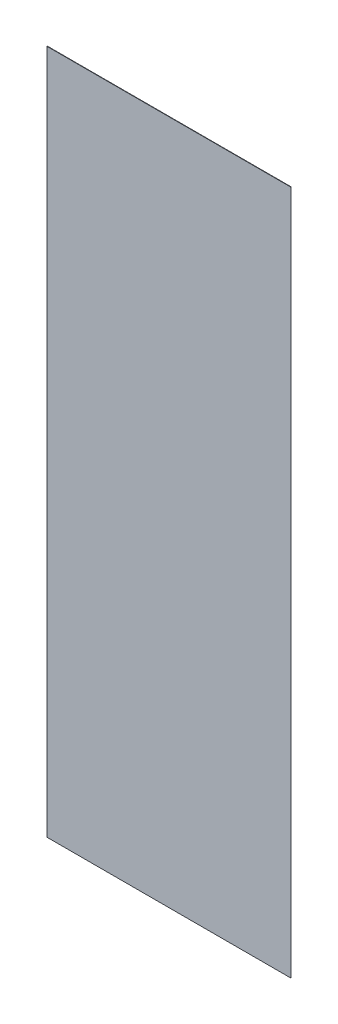
ISO-10303-21;
HEADER;
FILE_DESCRIPTION(('STEP AP214'),'2;1');
FILE_NAME('part.step','',(''),(''),'','','');
FILE_SCHEMA(('AUTOMOTIVE_DESIGN { 1 0 10303 214 1 1 1 1 }'));
ENDSEC;
DATA;
#1=APPLICATION_CONTEXT('core data for automotive mechanical design processes');
#2=APPLICATION_PROTOCOL_DEFINITION('international standard','automotive_design',2000,#1);
#3=PRODUCT_CONTEXT('',#1,'mechanical');
#4=PRODUCT('Part','Part','',(#3));
#5=PRODUCT_RELATED_PRODUCT_CATEGORY('part','',(#4));
#6=PRODUCT_DEFINITION_FORMATION('','',#4);
#7=PRODUCT_DEFINITION_CONTEXT('part definition',#1,'design');
#8=PRODUCT_DEFINITION('design','',#6,#7);
#9=PRODUCT_DEFINITION_SHAPE('','',#8);
#10=(LENGTH_UNIT() NAMED_UNIT(*) SI_UNIT(.MILLI.,.METRE.));
#11=(NAMED_UNIT(*) PLANE_ANGLE_UNIT() SI_UNIT($,.RADIAN.));
#12=(NAMED_UNIT(*) SI_UNIT($,.STERADIAN.) SOLID_ANGLE_UNIT());
#13=UNCERTAINTY_MEASURE_WITH_UNIT(LENGTH_MEASURE(1.E-05),#10,'distance_accuracy_value','');
#14=(GEOMETRIC_REPRESENTATION_CONTEXT(3) GLOBAL_UNCERTAINTY_ASSIGNED_CONTEXT((#13)) GLOBAL_UNIT_ASSIGNED_CONTEXT((#10,
#11,#12)) REPRESENTATION_CONTEXT('',''));
#15=CARTESIAN_POINT('',(0.,0.,0.));
#16=DIRECTION('',(0.,0.,1.));
#17=DIRECTION('',(1.,0.,0.));
#18=AXIS2_PLACEMENT_3D('',#15,#16,#17);
#19=CARTESIAN_POINT('',(42.5,241.5,-798.5));
#20=DIRECTION('',(-1.,0.,0.));
#21=DIRECTION('',(0.,0.,1.));
#22=AXIS2_PLACEMENT_3D('',#19,#20,#21);
#23=PLANE('',#22);
#24=DIRECTION('',(0.,-1.,0.));
#25=VECTOR('',#24,1.);
#26=CARTESIAN_POINT('',(42.5,241.5,-797.5));
#27=LINE('',#26,#25);
#28=CARTESIAN_POINT('',(42.5,1968.5,-797.5));
#29=VERTEX_POINT('',#28);
#30=CARTESIAN_POINT('',(42.5,241.5,-797.5));
#31=VERTEX_POINT('',#30);
#32=EDGE_CURVE('E103',#29,#31,#27,.T.);
#33=ORIENTED_EDGE('',*,*,#32,.F.);
#34=DIRECTION('',(0.,0.,1.));
#35=VECTOR('',#34,1.);
#36=CARTESIAN_POINT('',(42.5,1968.5,-798.5));
#37=LINE('',#36,#35);
#38=CARTESIAN_POINT('',(42.5,1968.5,-798.5));
#39=VERTEX_POINT('',#38);
#40=EDGE_CURVE('E11',#39,#29,#37,.T.);
#41=ORIENTED_EDGE('',*,*,#40,.F.);
#42=DIRECTION('',(0.,-1.,0.));
#43=VECTOR('',#42,1.);
#44=CARTESIAN_POINT('',(42.5,241.5,-798.5));
#45=LINE('',#44,#43);
#46=CARTESIAN_POINT('',(42.5,241.5,-798.5));
#47=VERTEX_POINT('',#46);
#48=EDGE_CURVE('E97',#39,#47,#45,.T.);
#49=ORIENTED_EDGE('',*,*,#48,.T.);
#50=DIRECTION('',(0.,0.,1.));
#51=VECTOR('',#50,1.);
#52=CARTESIAN_POINT('',(42.5,241.5,-798.5));
#53=LINE('',#52,#51);
#54=EDGE_CURVE('E42',#47,#31,#53,.T.);
#55=ORIENTED_EDGE('',*,*,#54,.T.);
#56=EDGE_LOOP('',(#33,#41,#49,#55));
#57=FACE_BOUND('',#56,.T.);
#58=ADVANCED_FACE('F39',(#57),#23,.T.);
#59=CARTESIAN_POINT('',(42.5,1968.5,-798.5));
#60=DIRECTION('',(0.,1.,0.));
#61=DIRECTION('',(0.,0.,1.));
#62=AXIS2_PLACEMENT_3D('',#59,#60,#61);
#63=PLANE('',#62);
#64=DIRECTION('',(-1.,0.,0.));
#65=VECTOR('',#64,1.);
#66=CARTESIAN_POINT('',(42.5,1968.5,-797.5));
#67=LINE('',#66,#65);
#68=CARTESIAN_POINT('',(657.5,1968.5,-797.5));
#69=VERTEX_POINT('',#68);
#70=EDGE_CURVE('E99',#69,#29,#67,.T.);
#71=ORIENTED_EDGE('',*,*,#70,.F.);
#72=DIRECTION('',(0.,0.,1.));
#73=VECTOR('',#72,1.);
#74=CARTESIAN_POINT('',(657.5,1968.5,-798.5));
#75=LINE('',#74,#73);
#76=CARTESIAN_POINT('',(657.5,1968.5,-798.5));
#77=VERTEX_POINT('',#76);
#78=EDGE_CURVE('E48',#77,#69,#75,.T.);
#79=ORIENTED_EDGE('',*,*,#78,.F.);
#80=DIRECTION('',(-1.,0.,0.));
#81=VECTOR('',#80,1.);
#82=CARTESIAN_POINT('',(42.5,1968.5,-798.5));
#83=LINE('',#82,#81);
#84=EDGE_CURVE('E94',#77,#39,#83,.T.);
#85=ORIENTED_EDGE('',*,*,#84,.T.);
#86=ORIENTED_EDGE('',*,*,#40,.T.);
#87=EDGE_LOOP('',(#71,#79,#85,#86));
#88=FACE_BOUND('',#87,.T.);
#89=ADVANCED_FACE('F113',(#88),#63,.T.);
#90=CARTESIAN_POINT('',(657.5,241.5,-798.5));
#91=DIRECTION('',(1.,0.,0.));
#92=DIRECTION('',(0.,0.,-1.));
#93=AXIS2_PLACEMENT_3D('',#90,#91,#92);
#94=PLANE('',#93);
#95=DIRECTION('',(0.,1.,0.));
#96=VECTOR('',#95,1.);
#97=CARTESIAN_POINT('',(657.5,241.5,-797.5));
#98=LINE('',#97,#96);
#99=CARTESIAN_POINT('',(657.5,241.5,-797.5));
#100=VERTEX_POINT('',#99);
#101=EDGE_CURVE('E89',#100,#69,#98,.T.);
#102=ORIENTED_EDGE('',*,*,#101,.F.);
#103=DIRECTION('',(0.,0.,1.));
#104=VECTOR('',#103,1.);
#105=CARTESIAN_POINT('',(657.5,241.5,-798.5));
#106=LINE('',#105,#104);
#107=CARTESIAN_POINT('',(657.5,241.5,-798.5));
#108=VERTEX_POINT('',#107);
#109=EDGE_CURVE('E84',#108,#100,#106,.T.);
#110=ORIENTED_EDGE('',*,*,#109,.F.);
#111=DIRECTION('',(0.,1.,0.));
#112=VECTOR('',#111,1.);
#113=CARTESIAN_POINT('',(657.5,241.5,-798.5));
#114=LINE('',#113,#112);
#115=EDGE_CURVE('E87',#108,#77,#114,.T.);
#116=ORIENTED_EDGE('',*,*,#115,.T.);
#117=ORIENTED_EDGE('',*,*,#78,.T.);
#118=EDGE_LOOP('',(#102,#110,#116,#117));
#119=FACE_BOUND('',#118,.T.);
#120=ADVANCED_FACE('F86',(#119),#94,.T.);
#121=CARTESIAN_POINT('',(42.5,241.5,-798.5));
#122=DIRECTION('',(0.,-1.,0.));
#123=DIRECTION('',(0.,0.,-1.));
#124=AXIS2_PLACEMENT_3D('',#121,#122,#123);
#125=PLANE('',#124);
#126=DIRECTION('',(1.,0.,0.));
#127=VECTOR('',#126,1.);
#128=CARTESIAN_POINT('',(42.5,241.5,-797.5));
#129=LINE('',#128,#127);
#130=EDGE_CURVE('E106',#31,#100,#129,.T.);
#131=ORIENTED_EDGE('',*,*,#130,.F.);
#132=ORIENTED_EDGE('',*,*,#54,.F.);
#133=DIRECTION('',(1.,0.,0.));
#134=VECTOR('',#133,1.);
#135=CARTESIAN_POINT('',(42.5,241.5,-798.5));
#136=LINE('',#135,#134);
#137=EDGE_CURVE('E93',#47,#108,#136,.T.);
#138=ORIENTED_EDGE('',*,*,#137,.T.);
#139=ORIENTED_EDGE('',*,*,#109,.T.);
#140=EDGE_LOOP('',(#131,#132,#138,#139));
#141=FACE_BOUND('',#140,.T.);
#142=ADVANCED_FACE('F96',(#141),#125,.T.);
#143=CARTESIAN_POINT('',(0.,0.,-798.5));
#144=DIRECTION('',(0.,0.,-1.));
#145=DIRECTION('',(-1.,0.,0.));
#146=AXIS2_PLACEMENT_3D('',#143,#144,#145);
#147=PLANE('',#146);
#148=ORIENTED_EDGE('',*,*,#48,.F.);
#149=ORIENTED_EDGE('',*,*,#84,.F.);
#150=ORIENTED_EDGE('',*,*,#115,.F.);
#151=ORIENTED_EDGE('',*,*,#137,.F.);
#152=EDGE_LOOP('',(#148,#149,#150,#151));
#153=FACE_BOUND('',#152,.T.);
#154=ADVANCED_FACE('F92',(#153),#147,.T.);
#155=CARTESIAN_POINT('',(0.,0.,-797.5));
#156=DIRECTION('',(0.,0.,-1.));
#157=DIRECTION('',(-1.,0.,0.));
#158=AXIS2_PLACEMENT_3D('',#155,#156,#157);
#159=PLANE('',#158);
#160=ORIENTED_EDGE('',*,*,#32,.T.);
#161=ORIENTED_EDGE('',*,*,#130,.T.);
#162=ORIENTED_EDGE('',*,*,#101,.T.);
#163=ORIENTED_EDGE('',*,*,#70,.T.);
#164=EDGE_LOOP('',(#160,#161,#162,#163));
#165=FACE_BOUND('',#164,.T.);
#166=ADVANCED_FACE('F112',(#165),#159,.F.);
#167=CLOSED_SHELL('',(#58,#89,#120,#142,#154,#166));
#168=MANIFOLD_SOLID_BREP('B2',#167);
#169=ADVANCED_BREP_SHAPE_REPRESENTATION('',(#18,#168),#14);
#170=SHAPE_DEFINITION_REPRESENTATION(#9,#169);
ENDSEC;
END-ISO-10303-21;
